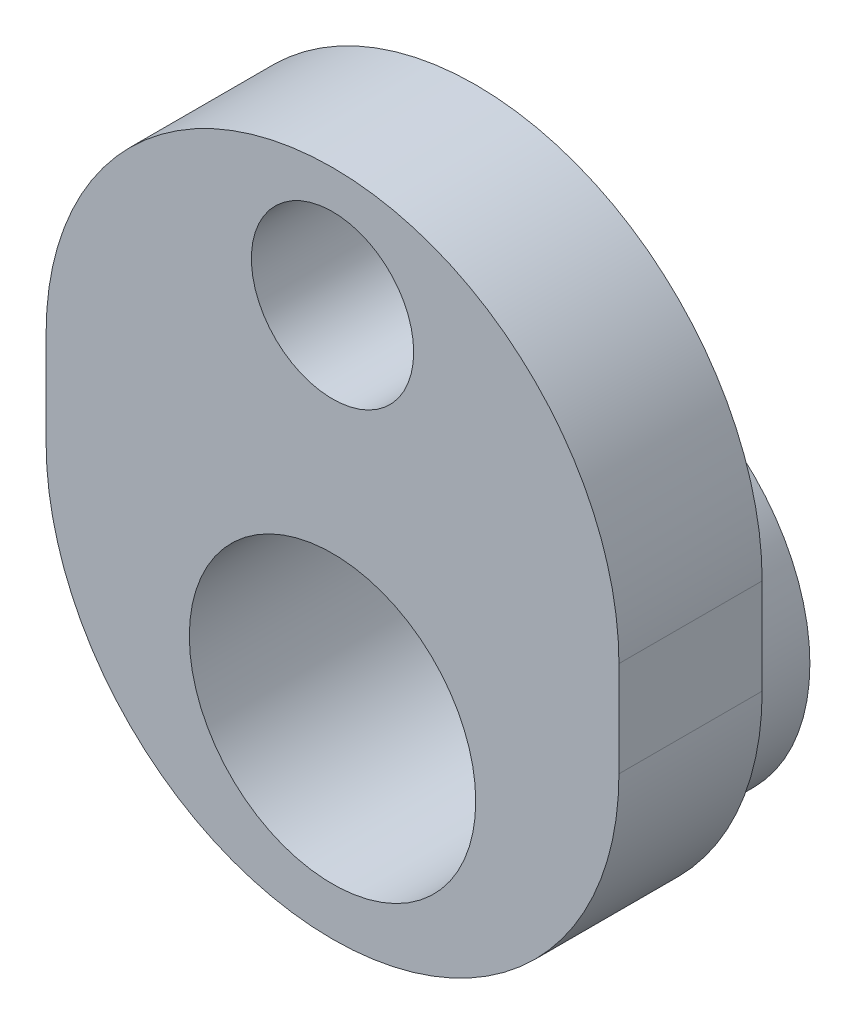
ISO-10303-21;
HEADER;
FILE_DESCRIPTION(('STEP AP214'),'2;1');
FILE_NAME('part.step','',(''),(''),'','','');
FILE_SCHEMA(('AUTOMOTIVE_DESIGN { 1 0 10303 214 1 1 1 1 }'));
ENDSEC;
DATA;
#1=APPLICATION_CONTEXT('core data for automotive mechanical design processes');
#2=APPLICATION_PROTOCOL_DEFINITION('international standard','automotive_design',2000,#1);
#3=PRODUCT_CONTEXT('',#1,'mechanical');
#4=PRODUCT('Part','Part','',(#3));
#5=PRODUCT_RELATED_PRODUCT_CATEGORY('part','',(#4));
#6=PRODUCT_DEFINITION_FORMATION('','',#4);
#7=PRODUCT_DEFINITION_CONTEXT('part definition',#1,'design');
#8=PRODUCT_DEFINITION('design','',#6,#7);
#9=PRODUCT_DEFINITION_SHAPE('','',#8);
#10=(LENGTH_UNIT() NAMED_UNIT(*) SI_UNIT(.MILLI.,.METRE.));
#11=(NAMED_UNIT(*) PLANE_ANGLE_UNIT() SI_UNIT($,.RADIAN.));
#12=(NAMED_UNIT(*) SI_UNIT($,.STERADIAN.) SOLID_ANGLE_UNIT());
#13=UNCERTAINTY_MEASURE_WITH_UNIT(LENGTH_MEASURE(1.E-05),#10,'distance_accuracy_value','');
#14=(GEOMETRIC_REPRESENTATION_CONTEXT(3) GLOBAL_UNCERTAINTY_ASSIGNED_CONTEXT((#13)) GLOBAL_UNIT_ASSIGNED_CONTEXT((#10,
#11,#12)) REPRESENTATION_CONTEXT('',''));
#15=CARTESIAN_POINT('',(0.,0.,0.));
#16=DIRECTION('',(0.,0.,1.));
#17=DIRECTION('',(1.,0.,0.));
#18=AXIS2_PLACEMENT_3D('',#15,#16,#17);
#19=CARTESIAN_POINT('',(-6.,0.,3.));
#20=DIRECTION('',(1.,0.,0.));
#21=DIRECTION('',(0.,0.,-1.));
#22=AXIS2_PLACEMENT_3D('',#19,#20,#21);
#23=PLANE('',#22);
#24=DIRECTION('',(0.,-1.,0.));
#25=VECTOR('',#24,1.);
#26=CARTESIAN_POINT('',(-6.,0.,0.));
#27=LINE('',#26,#25);
#28=CARTESIAN_POINT('',(-6.,4.,0.));
#29=VERTEX_POINT('',#28);
#30=CARTESIAN_POINT('',(-6.,2.,0.));
#31=VERTEX_POINT('',#30);
#32=EDGE_CURVE('E129',#29,#31,#27,.T.);
#33=ORIENTED_EDGE('',*,*,#32,.T.);
#34=DIRECTION('',(0.,0.,-1.));
#35=VECTOR('',#34,1.);
#36=CARTESIAN_POINT('',(-6.,2.,3.));
#37=LINE('',#36,#35);
#38=CARTESIAN_POINT('',(-6.,2.,3.));
#39=VERTEX_POINT('',#38);
#40=EDGE_CURVE('E11',#39,#31,#37,.T.);
#41=ORIENTED_EDGE('',*,*,#40,.F.);
#42=DIRECTION('',(0.,-1.,0.));
#43=VECTOR('',#42,1.);
#44=CARTESIAN_POINT('',(-6.,0.,3.));
#45=LINE('',#44,#43);
#46=CARTESIAN_POINT('',(-6.,4.,3.));
#47=VERTEX_POINT('',#46);
#48=EDGE_CURVE('E99',#47,#39,#45,.T.);
#49=ORIENTED_EDGE('',*,*,#48,.F.);
#50=DIRECTION('',(0.,0.,-1.));
#51=VECTOR('',#50,1.);
#52=CARTESIAN_POINT('',(-6.,4.,3.));
#53=LINE('',#52,#51);
#54=EDGE_CURVE('E128',#47,#29,#53,.T.);
#55=ORIENTED_EDGE('',*,*,#54,.T.);
#56=EDGE_LOOP('',(#33,#41,#49,#55));
#57=FACE_BOUND('',#56,.T.);
#58=ADVANCED_FACE('F45',(#57),#23,.F.);
#59=CARTESIAN_POINT('',(0.,2.,3.));
#60=DIRECTION('',(0.,0.,-1.));
#61=DIRECTION('',(-1.,0.,0.));
#62=AXIS2_PLACEMENT_3D('',#59,#60,#61);
#63=CYLINDRICAL_SURFACE('',#62,6.);
#64=CARTESIAN_POINT('',(0.,2.,0.));
#65=DIRECTION('',(0.,0.,1.));
#66=DIRECTION('',(1.,0.,0.));
#67=AXIS2_PLACEMENT_3D('',#64,#65,#66);
#68=CIRCLE('',#67,6.);
#69=CARTESIAN_POINT('',(0.,-4.,0.));
#70=VERTEX_POINT('',#69);
#71=EDGE_CURVE('E134',#31,#70,#68,.T.);
#72=ORIENTED_EDGE('',*,*,#71,.T.);
#73=CARTESIAN_POINT('',(6.,2.,0.));
#74=VERTEX_POINT('',#73);
#75=EDGE_CURVE('E107',#70,#74,#68,.T.);
#76=ORIENTED_EDGE('',*,*,#75,.T.);
#77=DIRECTION('',(0.,0.,-1.));
#78=VECTOR('',#77,1.);
#79=CARTESIAN_POINT('',(6.,2.,3.));
#80=LINE('',#79,#78);
#81=CARTESIAN_POINT('',(6.,2.,3.));
#82=VERTEX_POINT('',#81);
#83=EDGE_CURVE('E53',#82,#74,#80,.T.);
#84=ORIENTED_EDGE('',*,*,#83,.F.);
#85=CARTESIAN_POINT('',(0.,2.,3.));
#86=DIRECTION('',(0.,0.,1.));
#87=DIRECTION('',(1.,0.,0.));
#88=AXIS2_PLACEMENT_3D('',#85,#86,#87);
#89=CIRCLE('',#88,6.);
#90=EDGE_CURVE('E93',#39,#82,#89,.T.);
#91=ORIENTED_EDGE('',*,*,#90,.F.);
#92=ORIENTED_EDGE('',*,*,#40,.T.);
#93=EDGE_LOOP('',(#72,#76,#84,#91,#92));
#94=FACE_BOUND('',#93,.T.);
#95=ADVANCED_FACE('F105',(#94),#63,.T.);
#96=CARTESIAN_POINT('',(6.,0.,3.));
#97=DIRECTION('',(1.,0.,0.));
#98=DIRECTION('',(0.,1.,0.));
#99=AXIS2_PLACEMENT_3D('',#96,#97,#98);
#100=PLANE('',#99);
#101=DIRECTION('',(0.,-1.,0.));
#102=VECTOR('',#101,1.);
#103=CARTESIAN_POINT('',(6.,0.,0.));
#104=LINE('',#103,#102);
#105=CARTESIAN_POINT('',(6.,4.,0.));
#106=VERTEX_POINT('',#105);
#107=EDGE_CURVE('E137',#106,#74,#104,.T.);
#108=ORIENTED_EDGE('',*,*,#107,.F.);
#109=DIRECTION('',(0.,0.,-1.));
#110=VECTOR('',#109,1.);
#111=CARTESIAN_POINT('',(6.,4.,3.));
#112=LINE('',#111,#110);
#113=CARTESIAN_POINT('',(6.,4.,3.));
#114=VERTEX_POINT('',#113);
#115=EDGE_CURVE('E112',#114,#106,#112,.T.);
#116=ORIENTED_EDGE('',*,*,#115,.F.);
#117=DIRECTION('',(0.,-1.,0.));
#118=VECTOR('',#117,1.);
#119=CARTESIAN_POINT('',(6.,0.,3.));
#120=LINE('',#119,#118);
#121=EDGE_CURVE('E97',#114,#82,#120,.T.);
#122=ORIENTED_EDGE('',*,*,#121,.T.);
#123=ORIENTED_EDGE('',*,*,#83,.T.);
#124=EDGE_LOOP('',(#108,#116,#122,#123));
#125=FACE_BOUND('',#124,.T.);
#126=ADVANCED_FACE('F113',(#125),#100,.T.);
#127=CARTESIAN_POINT('',(0.,0.,3.));
#128=DIRECTION('',(0.,0.,-1.));
#129=DIRECTION('',(-1.,0.,0.));
#130=AXIS2_PLACEMENT_3D('',#127,#128,#129);
#131=CYLINDRICAL_SURFACE('',#130,3.);
#132=CARTESIAN_POINT('',(0.,0.,3.));
#133=DIRECTION('',(0.,0.,1.));
#134=DIRECTION('',(1.,0.,0.));
#135=AXIS2_PLACEMENT_3D('',#132,#133,#134);
#136=CIRCLE('',#135,3.);
#137=CARTESIAN_POINT('',(3.,0.,3.));
#138=VERTEX_POINT('',#137);
#139=EDGE_CURVE('E117',#138,#138,#136,.T.);
#140=ORIENTED_EDGE('',*,*,#139,.T.);
#141=EDGE_LOOP('',(#140));
#142=FACE_BOUND('',#141,.T.);
#143=CARTESIAN_POINT('',(0.,0.,-3.));
#144=DIRECTION('',(0.,0.,1.));
#145=DIRECTION('',(1.,0.,0.));
#146=AXIS2_PLACEMENT_3D('',#143,#144,#145);
#147=CIRCLE('',#146,3.);
#148=CARTESIAN_POINT('',(3.,0.,-3.));
#149=VERTEX_POINT('',#148);
#150=EDGE_CURVE('E159',#149,#149,#147,.T.);
#151=ORIENTED_EDGE('',*,*,#150,.F.);
#152=EDGE_LOOP('',(#151));
#153=FACE_BOUND('',#152,.T.);
#154=ADVANCED_FACE('F170',(#142,#153),#131,.F.);
#155=CARTESIAN_POINT('',(0.,4.,3.));
#156=DIRECTION('',(0.,0.,-1.));
#157=DIRECTION('',(-1.,0.,0.));
#158=AXIS2_PLACEMENT_3D('',#155,#156,#157);
#159=CYLINDRICAL_SURFACE('',#158,6.);
#160=CARTESIAN_POINT('',(0.,4.,0.));
#161=DIRECTION('',(0.,0.,1.));
#162=DIRECTION('',(1.,0.,0.));
#163=AXIS2_PLACEMENT_3D('',#160,#161,#162);
#164=CIRCLE('',#163,6.);
#165=EDGE_CURVE('E86',#106,#29,#164,.T.);
#166=ORIENTED_EDGE('',*,*,#165,.T.);
#167=ORIENTED_EDGE('',*,*,#54,.F.);
#168=CARTESIAN_POINT('',(0.,4.,3.));
#169=DIRECTION('',(0.,0.,1.));
#170=DIRECTION('',(1.,0.,0.));
#171=AXIS2_PLACEMENT_3D('',#168,#169,#170);
#172=CIRCLE('',#171,6.);
#173=EDGE_CURVE('E66',#114,#47,#172,.T.);
#174=ORIENTED_EDGE('',*,*,#173,.F.);
#175=ORIENTED_EDGE('',*,*,#115,.T.);
#176=EDGE_LOOP('',(#166,#167,#174,#175));
#177=FACE_BOUND('',#176,.T.);
#178=ADVANCED_FACE('F149',(#177),#159,.T.);
#179=CARTESIAN_POINT('',(0.,7.5,3.));
#180=DIRECTION('',(0.,0.,-1.));
#181=DIRECTION('',(-1.,0.,0.));
#182=AXIS2_PLACEMENT_3D('',#179,#180,#181);
#183=CYLINDRICAL_SURFACE('',#182,1.7);
#184=CARTESIAN_POINT('',(0.,7.5,3.));
#185=DIRECTION('',(0.,0.,1.));
#186=DIRECTION('',(1.,0.,0.));
#187=AXIS2_PLACEMENT_3D('',#184,#185,#186);
#188=CIRCLE('',#187,1.7);
#189=CARTESIAN_POINT('',(1.7,7.5,3.));
#190=VERTEX_POINT('',#189);
#191=EDGE_CURVE('E124',#190,#190,#188,.T.);
#192=ORIENTED_EDGE('',*,*,#191,.T.);
#193=EDGE_LOOP('',(#192));
#194=FACE_BOUND('',#193,.T.);
#195=CARTESIAN_POINT('',(0.,7.5,0.));
#196=DIRECTION('',(0.,0.,1.));
#197=DIRECTION('',(1.,0.,0.));
#198=AXIS2_PLACEMENT_3D('',#195,#196,#197);
#199=CIRCLE('',#198,1.7);
#200=CARTESIAN_POINT('',(1.7,7.5,0.));
#201=VERTEX_POINT('',#200);
#202=EDGE_CURVE('E142',#201,#201,#199,.T.);
#203=ORIENTED_EDGE('',*,*,#202,.F.);
#204=EDGE_LOOP('',(#203));
#205=FACE_BOUND('',#204,.T.);
#206=ADVANCED_FACE('F178',(#194,#205),#183,.F.);
#207=CARTESIAN_POINT('',(0.,0.,3.));
#208=DIRECTION('',(0.,0.,1.));
#209=DIRECTION('',(1.,0.,0.));
#210=AXIS2_PLACEMENT_3D('',#207,#208,#209);
#211=PLANE('',#210);
#212=ORIENTED_EDGE('',*,*,#48,.T.);
#213=ORIENTED_EDGE('',*,*,#90,.T.);
#214=ORIENTED_EDGE('',*,*,#121,.F.);
#215=ORIENTED_EDGE('',*,*,#173,.T.);
#216=EDGE_LOOP('',(#212,#213,#214,#215));
#217=FACE_BOUND('',#216,.T.);
#218=ORIENTED_EDGE('',*,*,#139,.F.);
#219=EDGE_LOOP('',(#218));
#220=FACE_BOUND('',#219,.T.);
#221=ORIENTED_EDGE('',*,*,#191,.F.);
#222=EDGE_LOOP('',(#221));
#223=FACE_BOUND('',#222,.T.);
#224=ADVANCED_FACE('F94',(#217,#220,#223),#211,.T.);
#225=CARTESIAN_POINT('',(0.,0.,0.));
#226=DIRECTION('',(0.,0.,1.));
#227=DIRECTION('',(1.,0.,0.));
#228=AXIS2_PLACEMENT_3D('',#225,#226,#227);
#229=PLANE('',#228);
#230=ORIENTED_EDGE('',*,*,#75,.F.);
#231=CARTESIAN_POINT('',(0.,0.,0.));
#232=DIRECTION('',(0.,0.,1.));
#233=DIRECTION('',(1.,0.,0.));
#234=AXIS2_PLACEMENT_3D('',#231,#232,#233);
#235=CIRCLE('',#234,4.);
#236=EDGE_CURVE('E58',#70,#70,#235,.T.);
#237=ORIENTED_EDGE('',*,*,#236,.T.);
#238=ORIENTED_EDGE('',*,*,#71,.F.);
#239=ORIENTED_EDGE('',*,*,#32,.F.);
#240=ORIENTED_EDGE('',*,*,#165,.F.);
#241=ORIENTED_EDGE('',*,*,#107,.T.);
#242=EDGE_LOOP('',(#230,#237,#238,#239,#240,#241));
#243=FACE_BOUND('',#242,.T.);
#244=ORIENTED_EDGE('',*,*,#202,.T.);
#245=EDGE_LOOP('',(#244));
#246=FACE_BOUND('',#245,.T.);
#247=ADVANCED_FACE('F152',(#243,#246),#229,.F.);
#248=CARTESIAN_POINT('',(0.,0.,-3.));
#249=DIRECTION('',(0.,0.,1.));
#250=DIRECTION('',(1.,0.,0.));
#251=AXIS2_PLACEMENT_3D('',#248,#249,#250);
#252=CYLINDRICAL_SURFACE('',#251,4.);
#253=CARTESIAN_POINT('',(0.,0.,-3.));
#254=DIRECTION('',(0.,0.,1.));
#255=DIRECTION('',(1.,0.,0.));
#256=AXIS2_PLACEMENT_3D('',#253,#254,#255);
#257=CIRCLE('',#256,4.);
#258=CARTESIAN_POINT('',(4.,0.,-3.));
#259=VERTEX_POINT('',#258);
#260=EDGE_CURVE('E133',#259,#259,#257,.T.);
#261=ORIENTED_EDGE('',*,*,#260,.T.);
#262=EDGE_LOOP('',(#261));
#263=FACE_BOUND('',#262,.T.);
#264=ORIENTED_EDGE('',*,*,#236,.F.);
#265=EDGE_LOOP('',(#264));
#266=FACE_BOUND('',#265,.T.);
#267=ADVANCED_FACE('F231',(#263,#266),#252,.T.);
#268=CARTESIAN_POINT('',(0.,0.,-3.));
#269=DIRECTION('',(0.,0.,1.));
#270=DIRECTION('',(1.,0.,0.));
#271=AXIS2_PLACEMENT_3D('',#268,#269,#270);
#272=PLANE('',#271);
#273=ORIENTED_EDGE('',*,*,#150,.T.);
#274=EDGE_LOOP('',(#273));
#275=FACE_BOUND('',#274,.T.);
#276=ORIENTED_EDGE('',*,*,#260,.F.);
#277=EDGE_LOOP('',(#276));
#278=FACE_BOUND('',#277,.T.);
#279=ADVANCED_FACE('F167',(#275,#278),#272,.F.);
#280=CLOSED_SHELL('',(#58,#95,#126,#154,#178,#206,#224,#247,#267,#279));
#281=MANIFOLD_SOLID_BREP('B2',#280);
#282=ADVANCED_BREP_SHAPE_REPRESENTATION('',(#18,#281),#14);
#283=SHAPE_DEFINITION_REPRESENTATION(#9,#282);
ENDSEC;
END-ISO-10303-21;
